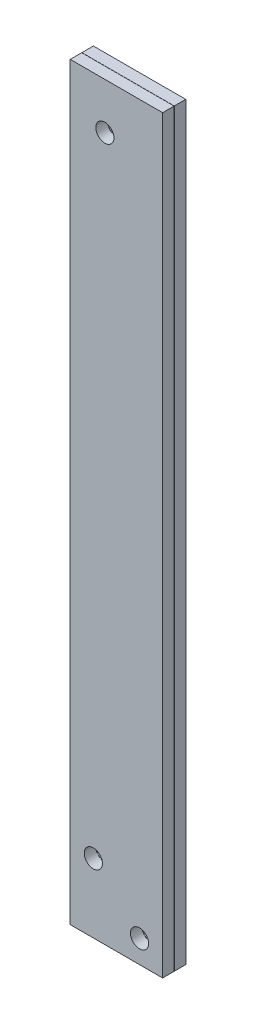
ISO-10303-21;
HEADER;
FILE_DESCRIPTION(('STEP AP214'),'2;1');
FILE_NAME('part.step','',(''),(''),'','','');
FILE_SCHEMA(('AUTOMOTIVE_DESIGN { 1 0 10303 214 1 1 1 1 }'));
ENDSEC;
DATA;
#1=APPLICATION_CONTEXT('core data for automotive mechanical design processes');
#2=APPLICATION_PROTOCOL_DEFINITION('international standard','automotive_design',2000,#1);
#3=PRODUCT_CONTEXT('',#1,'mechanical');
#4=PRODUCT('Part','Part','',(#3));
#5=PRODUCT_RELATED_PRODUCT_CATEGORY('part','',(#4));
#6=PRODUCT_DEFINITION_FORMATION('','',#4);
#7=PRODUCT_DEFINITION_CONTEXT('part definition',#1,'design');
#8=PRODUCT_DEFINITION('design','',#6,#7);
#9=PRODUCT_DEFINITION_SHAPE('','',#8);
#10=(LENGTH_UNIT() NAMED_UNIT(*) SI_UNIT(.MILLI.,.METRE.));
#11=(NAMED_UNIT(*) PLANE_ANGLE_UNIT() SI_UNIT($,.RADIAN.));
#12=(NAMED_UNIT(*) SI_UNIT($,.STERADIAN.) SOLID_ANGLE_UNIT());
#13=UNCERTAINTY_MEASURE_WITH_UNIT(LENGTH_MEASURE(1.E-05),#10,'distance_accuracy_value','');
#14=(GEOMETRIC_REPRESENTATION_CONTEXT(3) GLOBAL_UNCERTAINTY_ASSIGNED_CONTEXT((#13)) GLOBAL_UNIT_ASSIGNED_CONTEXT((#10,
#11,#12)) REPRESENTATION_CONTEXT('',''));
#15=CARTESIAN_POINT('',(0.,0.,0.));
#16=DIRECTION('',(0.,0.,1.));
#17=DIRECTION('',(1.,0.,0.));
#18=AXIS2_PLACEMENT_3D('',#15,#16,#17);
#19=CARTESIAN_POINT('',(0.,0.,6.41));
#20=DIRECTION('',(0.,0.,1.));
#21=DIRECTION('',(0.,-1.,0.));
#22=AXIS2_PLACEMENT_3D('',#19,#20,#21);
#23=PLANE('',#22);
#24=CARTESIAN_POINT('',(12.70000000003,-374.162201783294,6.40999999999995));
#25=DIRECTION('',(0.,0.,1.));
#26=DIRECTION('',(0.,-1.,0.));
#27=AXIS2_PLACEMENT_3D('',#24,#25,#26);
#28=CIRCLE('',#27,5.);
#29=CARTESIAN_POINT('',(12.70000000003,-379.162201783294,6.40999999999995));
#30=VERTEX_POINT('',#29);
#31=EDGE_CURVE('E158',#30,#30,#28,.T.);
#32=ORIENTED_EDGE('',*,*,#31,.T.);
#33=EDGE_LOOP('',(#32));
#34=FACE_BOUND('',#33,.T.);
#35=CARTESIAN_POINT('',(38.1000000000302,-399.562201783293,6.40999999999995));
#36=DIRECTION('',(0.,0.,1.));
#37=DIRECTION('',(0.,-1.,0.));
#38=AXIS2_PLACEMENT_3D('',#35,#36,#37);
#39=CIRCLE('',#38,5.);
#40=CARTESIAN_POINT('',(38.1000000000302,-404.562201783293,6.40999999999995));
#41=VERTEX_POINT('',#40);
#42=EDGE_CURVE('E160',#41,#41,#39,.T.);
#43=ORIENTED_EDGE('',*,*,#42,.T.);
#44=EDGE_LOOP('',(#43));
#45=FACE_BOUND('',#44,.T.);
#46=CARTESIAN_POINT('',(19.0400000000212,-25.3999999999761,6.41));
#47=DIRECTION('',(0.,0.,1.));
#48=DIRECTION('',(0.,-1.,0.));
#49=AXIS2_PLACEMENT_3D('',#46,#47,#48);
#50=CIRCLE('',#49,5.);
#51=CARTESIAN_POINT('',(19.0400000000212,-30.3999999999761,6.40999999999999));
#52=VERTEX_POINT('',#51);
#53=EDGE_CURVE('E111',#52,#52,#50,.T.);
#54=ORIENTED_EDGE('',*,*,#53,.T.);
#55=EDGE_LOOP('',(#54));
#56=FACE_BOUND('',#55,.T.);
#57=DIRECTION('',(0.,-1.,0.));
#58=VECTOR('',#57,1.);
#59=CARTESIAN_POINT('',(50.7999999999999,0.,6.41));
#60=LINE('',#59,#58);
#61=CARTESIAN_POINT('',(50.7999999999999,0.,6.41));
#62=VERTEX_POINT('',#61);
#63=CARTESIAN_POINT('',(50.8,-412.09566061,6.40999999999995));
#64=VERTEX_POINT('',#63);
#65=EDGE_CURVE('E108',#62,#64,#60,.T.);
#66=ORIENTED_EDGE('',*,*,#65,.T.);
#67=DIRECTION('',(1.,0.,0.));
#68=VECTOR('',#67,1.);
#69=CARTESIAN_POINT('',(0.,-412.09566061,6.40999999999995));
#70=LINE('',#69,#68);
#71=CARTESIAN_POINT('',(0.,-412.09566061,6.40999999999995));
#72=VERTEX_POINT('',#71);
#73=EDGE_CURVE('E12',#72,#64,#70,.T.);
#74=ORIENTED_EDGE('',*,*,#73,.F.);
#75=DIRECTION('',(0.,-1.,0.));
#76=VECTOR('',#75,1.);
#77=CARTESIAN_POINT('',(0.,0.,6.41));
#78=LINE('',#77,#76);
#79=CARTESIAN_POINT('',(0.,0.,6.41));
#80=VERTEX_POINT('',#79);
#81=EDGE_CURVE('E62',#80,#72,#78,.T.);
#82=ORIENTED_EDGE('',*,*,#81,.F.);
#83=DIRECTION('',(1.,0.,0.));
#84=VECTOR('',#83,1.);
#85=CARTESIAN_POINT('',(0.,0.,6.41));
#86=LINE('',#85,#84);
#87=EDGE_CURVE('E47',#80,#62,#86,.T.);
#88=ORIENTED_EDGE('',*,*,#87,.T.);
#89=EDGE_LOOP('',(#66,#74,#82,#88));
#90=FACE_BOUND('',#89,.T.);
#91=ADVANCED_FACE('F44',(#34,#45,#56,#90),#23,.F.);
#92=CARTESIAN_POINT('',(0.,-412.09566061,0.));
#93=DIRECTION('',(0.,-1.,0.));
#94=DIRECTION('',(1.,0.,0.));
#95=AXIS2_PLACEMENT_3D('',#92,#93,#94);
#96=PLANE('',#95);
#97=DIRECTION('',(0.,0.,-1.));
#98=VECTOR('',#97,1.);
#99=CARTESIAN_POINT('',(50.8,-412.09566061,0.));
#100=LINE('',#99,#98);
#101=CARTESIAN_POINT('',(50.8,-412.09566061,12.7199999999999));
#102=VERTEX_POINT('',#101);
#103=EDGE_CURVE('E103',#102,#64,#100,.T.);
#104=ORIENTED_EDGE('',*,*,#103,.F.);
#105=DIRECTION('',(1.,0.,0.));
#106=VECTOR('',#105,1.);
#107=CARTESIAN_POINT('',(0.,-412.09566061,12.7199999999999));
#108=LINE('',#107,#106);
#109=CARTESIAN_POINT('',(0.,-412.09566061,12.7199999999999));
#110=VERTEX_POINT('',#109);
#111=EDGE_CURVE('E53',#110,#102,#108,.T.);
#112=ORIENTED_EDGE('',*,*,#111,.F.);
#113=DIRECTION('',(0.,0.,-1.));
#114=VECTOR('',#113,1.);
#115=CARTESIAN_POINT('',(0.,-412.09566061,0.));
#116=LINE('',#115,#114);
#117=EDGE_CURVE('E99',#110,#72,#116,.T.);
#118=ORIENTED_EDGE('',*,*,#117,.T.);
#119=ORIENTED_EDGE('',*,*,#73,.T.);
#120=EDGE_LOOP('',(#104,#112,#118,#119));
#121=FACE_BOUND('',#120,.T.);
#122=ADVANCED_FACE('F119',(#121),#96,.T.);
#123=CARTESIAN_POINT('',(0.,0.,12.72));
#124=DIRECTION('',(0.,0.,1.));
#125=DIRECTION('',(0.,-1.,0.));
#126=AXIS2_PLACEMENT_3D('',#123,#124,#125);
#127=PLANE('',#126);
#128=CARTESIAN_POINT('',(12.70000000003,-374.162201783294,12.72));
#129=DIRECTION('',(0.,0.,1.));
#130=DIRECTION('',(1.,0.,0.));
#131=AXIS2_PLACEMENT_3D('',#128,#129,#130);
#132=CIRCLE('',#131,5.);
#133=CARTESIAN_POINT('',(17.70000000003,-374.162201783294,12.72));
#134=VERTEX_POINT('',#133);
#135=EDGE_CURVE('E155',#134,#134,#132,.T.);
#136=ORIENTED_EDGE('',*,*,#135,.F.);
#137=EDGE_LOOP('',(#136));
#138=FACE_BOUND('',#137,.T.);
#139=CARTESIAN_POINT('',(38.1000000000302,-399.562201783293,12.72));
#140=DIRECTION('',(0.,0.,1.));
#141=DIRECTION('',(1.,0.,0.));
#142=AXIS2_PLACEMENT_3D('',#139,#140,#141);
#143=CIRCLE('',#142,5.);
#144=CARTESIAN_POINT('',(43.1000000000302,-399.562201783293,12.72));
#145=VERTEX_POINT('',#144);
#146=EDGE_CURVE('E172',#145,#145,#143,.T.);
#147=ORIENTED_EDGE('',*,*,#146,.F.);
#148=EDGE_LOOP('',(#147));
#149=FACE_BOUND('',#148,.T.);
#150=CARTESIAN_POINT('',(19.0400000000212,-25.3999999999761,12.72));
#151=DIRECTION('',(0.,0.,1.));
#152=DIRECTION('',(1.,0.,0.));
#153=AXIS2_PLACEMENT_3D('',#150,#151,#152);
#154=CIRCLE('',#153,5.);
#155=CARTESIAN_POINT('',(24.0400000000212,-25.3999999999761,12.72));
#156=VERTEX_POINT('',#155);
#157=EDGE_CURVE('E159',#156,#156,#154,.T.);
#158=ORIENTED_EDGE('',*,*,#157,.F.);
#159=EDGE_LOOP('',(#158));
#160=FACE_BOUND('',#159,.T.);
#161=DIRECTION('',(0.,-1.,0.));
#162=VECTOR('',#161,1.);
#163=CARTESIAN_POINT('',(50.7999999999999,0.,12.72));
#164=LINE('',#163,#162);
#165=CARTESIAN_POINT('',(50.7999999999999,0.,12.72));
#166=VERTEX_POINT('',#165);
#167=EDGE_CURVE('E95',#166,#102,#164,.T.);
#168=ORIENTED_EDGE('',*,*,#167,.F.);
#169=DIRECTION('',(1.,0.,0.));
#170=VECTOR('',#169,1.);
#171=CARTESIAN_POINT('',(0.,0.,12.72));
#172=LINE('',#171,#170);
#173=CARTESIAN_POINT('',(0.,0.,12.72));
#174=VERTEX_POINT('',#173);
#175=EDGE_CURVE('E91',#174,#166,#172,.T.);
#176=ORIENTED_EDGE('',*,*,#175,.F.);
#177=DIRECTION('',(0.,-1.,0.));
#178=VECTOR('',#177,1.);
#179=CARTESIAN_POINT('',(0.,0.,12.72));
#180=LINE('',#179,#178);
#181=EDGE_CURVE('E94',#174,#110,#180,.T.);
#182=ORIENTED_EDGE('',*,*,#181,.T.);
#183=ORIENTED_EDGE('',*,*,#111,.T.);
#184=EDGE_LOOP('',(#168,#176,#182,#183));
#185=FACE_BOUND('',#184,.T.);
#186=ADVANCED_FACE('F93',(#138,#149,#160,#185),#127,.T.);
#187=CARTESIAN_POINT('',(0.,0.,0.));
#188=DIRECTION('',(0.,1.,0.));
#189=DIRECTION('',(-1.,0.,0.));
#190=AXIS2_PLACEMENT_3D('',#187,#188,#189);
#191=PLANE('',#190);
#192=DIRECTION('',(0.,0.,1.));
#193=VECTOR('',#192,1.);
#194=CARTESIAN_POINT('',(50.7999999999999,0.,0.));
#195=LINE('',#194,#193);
#196=EDGE_CURVE('E110',#62,#166,#195,.T.);
#197=ORIENTED_EDGE('',*,*,#196,.F.);
#198=ORIENTED_EDGE('',*,*,#87,.F.);
#199=DIRECTION('',(0.,0.,1.));
#200=VECTOR('',#199,1.);
#201=CARTESIAN_POINT('',(0.,0.,0.));
#202=LINE('',#201,#200);
#203=EDGE_CURVE('E98',#80,#174,#202,.T.);
#204=ORIENTED_EDGE('',*,*,#203,.T.);
#205=ORIENTED_EDGE('',*,*,#175,.T.);
#206=EDGE_LOOP('',(#197,#198,#204,#205));
#207=FACE_BOUND('',#206,.T.);
#208=ADVANCED_FACE('F101',(#207),#191,.T.);
#209=CARTESIAN_POINT('',(0.,0.,0.));
#210=DIRECTION('',(1.,0.,0.));
#211=DIRECTION('',(0.,1.,0.));
#212=AXIS2_PLACEMENT_3D('',#209,#210,#211);
#213=PLANE('',#212);
#214=ORIENTED_EDGE('',*,*,#81,.T.);
#215=ORIENTED_EDGE('',*,*,#117,.F.);
#216=ORIENTED_EDGE('',*,*,#181,.F.);
#217=ORIENTED_EDGE('',*,*,#203,.F.);
#218=EDGE_LOOP('',(#214,#215,#216,#217));
#219=FACE_BOUND('',#218,.T.);
#220=ADVANCED_FACE('F97',(#219),#213,.F.);
#221=CARTESIAN_POINT('',(50.7999999999999,0.,0.));
#222=DIRECTION('',(1.,0.,0.));
#223=DIRECTION('',(0.,1.,0.));
#224=AXIS2_PLACEMENT_3D('',#221,#222,#223);
#225=PLANE('',#224);
#226=ORIENTED_EDGE('',*,*,#65,.F.);
#227=ORIENTED_EDGE('',*,*,#196,.T.);
#228=ORIENTED_EDGE('',*,*,#167,.T.);
#229=ORIENTED_EDGE('',*,*,#103,.T.);
#230=EDGE_LOOP('',(#226,#227,#228,#229));
#231=FACE_BOUND('',#230,.T.);
#232=ADVANCED_FACE('F118',(#231),#225,.T.);
#233=CARTESIAN_POINT('',(19.0400000000212,-25.3999999999761,-18.28));
#234=DIRECTION('',(0.,0.,1.));
#235=DIRECTION('',(1.,0.,0.));
#236=AXIS2_PLACEMENT_3D('',#233,#234,#235);
#237=CYLINDRICAL_SURFACE('',#236,5.);
#238=ORIENTED_EDGE('',*,*,#157,.T.);
#239=EDGE_LOOP('',(#238));
#240=FACE_BOUND('',#239,.T.);
#241=ORIENTED_EDGE('',*,*,#53,.F.);
#242=EDGE_LOOP('',(#241));
#243=FACE_BOUND('',#242,.T.);
#244=ADVANCED_FACE('F138',(#240,#243),#237,.F.);
#245=CARTESIAN_POINT('',(38.1000000000302,-399.562201783293,-22.28));
#246=DIRECTION('',(0.,0.,1.));
#247=DIRECTION('',(1.,0.,0.));
#248=AXIS2_PLACEMENT_3D('',#245,#246,#247);
#249=CYLINDRICAL_SURFACE('',#248,5.);
#250=ORIENTED_EDGE('',*,*,#146,.T.);
#251=EDGE_LOOP('',(#250));
#252=FACE_BOUND('',#251,.T.);
#253=ORIENTED_EDGE('',*,*,#42,.F.);
#254=EDGE_LOOP('',(#253));
#255=FACE_BOUND('',#254,.T.);
#256=ADVANCED_FACE('F142',(#252,#255),#249,.F.);
#257=CARTESIAN_POINT('',(12.70000000003,-374.162201783294,-22.28));
#258=DIRECTION('',(0.,0.,1.));
#259=DIRECTION('',(1.,0.,0.));
#260=AXIS2_PLACEMENT_3D('',#257,#258,#259);
#261=CYLINDRICAL_SURFACE('',#260,5.);
#262=ORIENTED_EDGE('',*,*,#135,.T.);
#263=EDGE_LOOP('',(#262));
#264=FACE_BOUND('',#263,.T.);
#265=ORIENTED_EDGE('',*,*,#31,.F.);
#266=EDGE_LOOP('',(#265));
#267=FACE_BOUND('',#266,.T.);
#268=ADVANCED_FACE('F146',(#264,#267),#261,.F.);
#269=CLOSED_SHELL('',(#91,#122,#186,#208,#220,#232,#244,#256,#268));
#270=MANIFOLD_SOLID_BREP('B2',#269);
#271=CARTESIAN_POINT('',(0.,-412.09566061,6.31));
#272=DIRECTION('',(1.,0.,0.));
#273=DIRECTION('',(0.,0.,-1.));
#274=AXIS2_PLACEMENT_3D('',#271,#272,#273);
#275=PLANE('',#274);
#276=DIRECTION('',(0.,-1.,0.));
#277=VECTOR('',#276,1.);
#278=CARTESIAN_POINT('',(0.,-412.09566061,0.));
#279=LINE('',#278,#277);
#280=CARTESIAN_POINT('',(0.,0.,0.));
#281=VERTEX_POINT('',#280);
#282=CARTESIAN_POINT('',(0.,-412.09566061,0.));
#283=VERTEX_POINT('',#282);
#284=EDGE_CURVE('E296',#281,#283,#279,.T.);
#285=ORIENTED_EDGE('',*,*,#284,.T.);
#286=DIRECTION('',(0.,0.,-1.));
#287=VECTOR('',#286,1.);
#288=CARTESIAN_POINT('',(0.,-412.09566061,6.31));
#289=LINE('',#288,#287);
#290=CARTESIAN_POINT('',(0.,-412.09566061,6.31));
#291=VERTEX_POINT('',#290);
#292=EDGE_CURVE('E42',#291,#283,#289,.T.);
#293=ORIENTED_EDGE('',*,*,#292,.F.);
#294=DIRECTION('',(0.,-1.,0.));
#295=VECTOR('',#294,1.);
#296=CARTESIAN_POINT('',(0.,-412.09566061,6.31));
#297=LINE('',#296,#295);
#298=CARTESIAN_POINT('',(0.,0.,6.31));
#299=VERTEX_POINT('',#298);
#300=EDGE_CURVE('E282',#299,#291,#297,.T.);
#301=ORIENTED_EDGE('',*,*,#300,.F.);
#302=DIRECTION('',(0.,0.,-1.));
#303=VECTOR('',#302,1.);
#304=CARTESIAN_POINT('',(0.,0.,6.31));
#305=LINE('',#304,#303);
#306=EDGE_CURVE('E292',#299,#281,#305,.T.);
#307=ORIENTED_EDGE('',*,*,#306,.T.);
#308=EDGE_LOOP('',(#285,#293,#301,#307));
#309=FACE_BOUND('',#308,.T.);
#310=ADVANCED_FACE('F230',(#309),#275,.F.);
#311=CARTESIAN_POINT('',(50.8,-412.09566061,6.31));
#312=DIRECTION('',(0.,1.,0.));
#313=DIRECTION('',(0.,0.,1.));
#314=AXIS2_PLACEMENT_3D('',#311,#312,#313);
#315=PLANE('',#314);
#316=DIRECTION('',(1.,0.,0.));
#317=VECTOR('',#316,1.);
#318=CARTESIAN_POINT('',(50.8,-412.09566061,0.));
#319=LINE('',#318,#317);
#320=CARTESIAN_POINT('',(50.8,-412.09566061,0.));
#321=VERTEX_POINT('',#320);
#322=EDGE_CURVE('E287',#283,#321,#319,.T.);
#323=ORIENTED_EDGE('',*,*,#322,.T.);
#324=DIRECTION('',(0.,0.,-1.));
#325=VECTOR('',#324,1.);
#326=CARTESIAN_POINT('',(50.8,-412.09566061,6.31));
#327=LINE('',#326,#325);
#328=CARTESIAN_POINT('',(50.8,-412.09566061,6.31));
#329=VERTEX_POINT('',#328);
#330=EDGE_CURVE('E239',#329,#321,#327,.T.);
#331=ORIENTED_EDGE('',*,*,#330,.F.);
#332=DIRECTION('',(1.,0.,0.));
#333=VECTOR('',#332,1.);
#334=CARTESIAN_POINT('',(50.8,-412.09566061,6.31));
#335=LINE('',#334,#333);
#336=EDGE_CURVE('E277',#291,#329,#335,.T.);
#337=ORIENTED_EDGE('',*,*,#336,.F.);
#338=ORIENTED_EDGE('',*,*,#292,.T.);
#339=EDGE_LOOP('',(#323,#331,#337,#338));
#340=FACE_BOUND('',#339,.T.);
#341=ADVANCED_FACE('F286',(#340),#315,.F.);
#342=CARTESIAN_POINT('',(50.7999999999999,0.,6.31));
#343=DIRECTION('',(-1.,0.,0.));
#344=DIRECTION('',(0.,-1.,0.));
#345=AXIS2_PLACEMENT_3D('',#342,#343,#344);
#346=PLANE('',#345);
#347=DIRECTION('',(0.,1.,0.));
#348=VECTOR('',#347,1.);
#349=CARTESIAN_POINT('',(50.7999999999999,0.,0.));
#350=LINE('',#349,#348);
#351=CARTESIAN_POINT('',(50.7999999999999,0.,0.));
#352=VERTEX_POINT('',#351);
#353=EDGE_CURVE('E264',#321,#352,#350,.T.);
#354=ORIENTED_EDGE('',*,*,#353,.T.);
#355=DIRECTION('',(0.,0.,-1.));
#356=VECTOR('',#355,1.);
#357=CARTESIAN_POINT('',(50.7999999999999,0.,6.31));
#358=LINE('',#357,#356);
#359=CARTESIAN_POINT('',(50.7999999999999,0.,6.31));
#360=VERTEX_POINT('',#359);
#361=EDGE_CURVE('E288',#360,#352,#358,.T.);
#362=ORIENTED_EDGE('',*,*,#361,.F.);
#363=DIRECTION('',(0.,1.,0.));
#364=VECTOR('',#363,1.);
#365=CARTESIAN_POINT('',(50.8,-361.29566061,6.31));
#366=LINE('',#365,#364);
#367=EDGE_CURVE('E280',#329,#360,#366,.T.);
#368=ORIENTED_EDGE('',*,*,#367,.F.);
#369=ORIENTED_EDGE('',*,*,#330,.T.);
#370=EDGE_LOOP('',(#354,#362,#368,#369));
#371=FACE_BOUND('',#370,.T.);
#372=ADVANCED_FACE('F290',(#371),#346,.F.);
#373=CARTESIAN_POINT('',(0.,0.,6.31));
#374=DIRECTION('',(0.,-1.,0.));
#375=DIRECTION('',(0.,0.,-1.));
#376=AXIS2_PLACEMENT_3D('',#373,#374,#375);
#377=PLANE('',#376);
#378=DIRECTION('',(-1.,0.,0.));
#379=VECTOR('',#378,1.);
#380=CARTESIAN_POINT('',(0.,0.,0.));
#381=LINE('',#380,#379);
#382=EDGE_CURVE('E270',#352,#281,#381,.T.);
#383=ORIENTED_EDGE('',*,*,#382,.T.);
#384=ORIENTED_EDGE('',*,*,#306,.F.);
#385=DIRECTION('',(-1.,0.,0.));
#386=VECTOR('',#385,1.);
#387=CARTESIAN_POINT('',(0.,0.,6.31));
#388=LINE('',#387,#386);
#389=EDGE_CURVE('E248',#360,#299,#388,.T.);
#390=ORIENTED_EDGE('',*,*,#389,.F.);
#391=ORIENTED_EDGE('',*,*,#361,.T.);
#392=EDGE_LOOP('',(#383,#384,#390,#391));
#393=FACE_BOUND('',#392,.T.);
#394=ADVANCED_FACE('F347',(#393),#377,.F.);
#395=CARTESIAN_POINT('',(0.,0.,6.31));
#396=DIRECTION('',(0.,0.,-1.));
#397=DIRECTION('',(-1.,0.,0.));
#398=AXIS2_PLACEMENT_3D('',#395,#396,#397);
#399=PLANE('',#398);
#400=CARTESIAN_POINT('',(12.70000000003,-374.162201783294,6.31));
#401=DIRECTION('',(0.,0.,-1.));
#402=DIRECTION('',(-1.,0.,0.));
#403=AXIS2_PLACEMENT_3D('',#400,#401,#402);
#404=CIRCLE('',#403,5.);
#405=CARTESIAN_POINT('',(7.70000000002996,-374.162201783294,6.31));
#406=VERTEX_POINT('',#405);
#407=EDGE_CURVE('E307',#406,#406,#404,.T.);
#408=ORIENTED_EDGE('',*,*,#407,.T.);
#409=EDGE_LOOP('',(#408));
#410=FACE_BOUND('',#409,.T.);
#411=CARTESIAN_POINT('',(38.1000000000302,-399.562201783293,6.31));
#412=DIRECTION('',(0.,0.,-1.));
#413=DIRECTION('',(-1.,0.,0.));
#414=AXIS2_PLACEMENT_3D('',#411,#412,#413);
#415=CIRCLE('',#414,5.);
#416=CARTESIAN_POINT('',(33.1000000000302,-399.562201783293,6.31));
#417=VERTEX_POINT('',#416);
#418=EDGE_CURVE('E310',#417,#417,#415,.T.);
#419=ORIENTED_EDGE('',*,*,#418,.T.);
#420=EDGE_LOOP('',(#419));
#421=FACE_BOUND('',#420,.T.);
#422=CARTESIAN_POINT('',(19.0400000000212,-25.3999999999761,6.31));
#423=DIRECTION('',(0.,0.,-1.));
#424=DIRECTION('',(-1.,0.,0.));
#425=AXIS2_PLACEMENT_3D('',#422,#423,#424);
#426=CIRCLE('',#425,5.);
#427=CARTESIAN_POINT('',(14.0400000000212,-25.3999999999761,6.31));
#428=VERTEX_POINT('',#427);
#429=EDGE_CURVE('E299',#428,#428,#426,.T.);
#430=ORIENTED_EDGE('',*,*,#429,.T.);
#431=EDGE_LOOP('',(#430));
#432=FACE_BOUND('',#431,.T.);
#433=ORIENTED_EDGE('',*,*,#300,.T.);
#434=ORIENTED_EDGE('',*,*,#336,.T.);
#435=ORIENTED_EDGE('',*,*,#367,.T.);
#436=ORIENTED_EDGE('',*,*,#389,.T.);
#437=EDGE_LOOP('',(#433,#434,#435,#436));
#438=FACE_BOUND('',#437,.T.);
#439=ADVANCED_FACE('F278',(#410,#421,#432,#438),#399,.F.);
#440=CARTESIAN_POINT('',(0.,0.,0.));
#441=DIRECTION('',(0.,0.,-1.));
#442=DIRECTION('',(-1.,0.,0.));
#443=AXIS2_PLACEMENT_3D('',#440,#441,#442);
#444=PLANE('',#443);
#445=CARTESIAN_POINT('',(12.70000000003,-374.162201783294,0.));
#446=DIRECTION('',(0.,0.,-1.));
#447=DIRECTION('',(-1.,0.,0.));
#448=AXIS2_PLACEMENT_3D('',#445,#446,#447);
#449=CIRCLE('',#448,5.);
#450=CARTESIAN_POINT('',(7.70000000002996,-374.162201783294,0.));
#451=VERTEX_POINT('',#450);
#452=EDGE_CURVE('E233',#451,#451,#449,.T.);
#453=ORIENTED_EDGE('',*,*,#452,.F.);
#454=EDGE_LOOP('',(#453));
#455=FACE_BOUND('',#454,.T.);
#456=CARTESIAN_POINT('',(38.1000000000302,-399.562201783293,0.));
#457=DIRECTION('',(0.,0.,-1.));
#458=DIRECTION('',(-1.,0.,0.));
#459=AXIS2_PLACEMENT_3D('',#456,#457,#458);
#460=CIRCLE('',#459,5.);
#461=CARTESIAN_POINT('',(33.1000000000302,-399.562201783293,0.));
#462=VERTEX_POINT('',#461);
#463=EDGE_CURVE('E308',#462,#462,#460,.T.);
#464=ORIENTED_EDGE('',*,*,#463,.F.);
#465=EDGE_LOOP('',(#464));
#466=FACE_BOUND('',#465,.T.);
#467=CARTESIAN_POINT('',(19.0400000000212,-25.3999999999761,0.));
#468=DIRECTION('',(0.,0.,-1.));
#469=DIRECTION('',(-1.,0.,0.));
#470=AXIS2_PLACEMENT_3D('',#467,#468,#469);
#471=CIRCLE('',#470,5.);
#472=CARTESIAN_POINT('',(14.0400000000212,-25.3999999999761,0.));
#473=VERTEX_POINT('',#472);
#474=EDGE_CURVE('E305',#473,#473,#471,.T.);
#475=ORIENTED_EDGE('',*,*,#474,.F.);
#476=EDGE_LOOP('',(#475));
#477=FACE_BOUND('',#476,.T.);
#478=ORIENTED_EDGE('',*,*,#284,.F.);
#479=ORIENTED_EDGE('',*,*,#382,.F.);
#480=ORIENTED_EDGE('',*,*,#353,.F.);
#481=ORIENTED_EDGE('',*,*,#322,.F.);
#482=EDGE_LOOP('',(#478,#479,#480,#481));
#483=FACE_BOUND('',#482,.T.);
#484=ADVANCED_FACE('F328',(#455,#466,#477,#483),#444,.T.);
#485=CARTESIAN_POINT('',(19.0400000000212,-25.3999999999761,-18.28));
#486=DIRECTION('',(0.,0.,1.));
#487=DIRECTION('',(1.,0.,0.));
#488=AXIS2_PLACEMENT_3D('',#485,#486,#487);
#489=CYLINDRICAL_SURFACE('',#488,5.);
#490=ORIENTED_EDGE('',*,*,#474,.T.);
#491=EDGE_LOOP('',(#490));
#492=FACE_BOUND('',#491,.T.);
#493=ORIENTED_EDGE('',*,*,#429,.F.);
#494=EDGE_LOOP('',(#493));
#495=FACE_BOUND('',#494,.T.);
#496=ADVANCED_FACE('F325',(#492,#495),#489,.F.);
#497=CARTESIAN_POINT('',(38.1000000000302,-399.562201783293,-22.28));
#498=DIRECTION('',(0.,0.,1.));
#499=DIRECTION('',(1.,0.,0.));
#500=AXIS2_PLACEMENT_3D('',#497,#498,#499);
#501=CYLINDRICAL_SURFACE('',#500,5.);
#502=ORIENTED_EDGE('',*,*,#463,.T.);
#503=EDGE_LOOP('',(#502));
#504=FACE_BOUND('',#503,.T.);
#505=ORIENTED_EDGE('',*,*,#418,.F.);
#506=EDGE_LOOP('',(#505));
#507=FACE_BOUND('',#506,.T.);
#508=ADVANCED_FACE('F327',(#504,#507),#501,.F.);
#509=CARTESIAN_POINT('',(12.70000000003,-374.162201783294,-22.28));
#510=DIRECTION('',(0.,0.,1.));
#511=DIRECTION('',(1.,0.,0.));
#512=AXIS2_PLACEMENT_3D('',#509,#510,#511);
#513=CYLINDRICAL_SURFACE('',#512,5.);
#514=ORIENTED_EDGE('',*,*,#452,.T.);
#515=EDGE_LOOP('',(#514));
#516=FACE_BOUND('',#515,.T.);
#517=ORIENTED_EDGE('',*,*,#407,.F.);
#518=EDGE_LOOP('',(#517));
#519=FACE_BOUND('',#518,.T.);
#520=ADVANCED_FACE('F335',(#516,#519),#513,.F.);
#521=CLOSED_SHELL('',(#310,#341,#372,#394,#439,#484,#496,#508,#520));
#522=MANIFOLD_SOLID_BREP('B6',#521);
#523=ADVANCED_BREP_SHAPE_REPRESENTATION('',(#18,#270,#522),#14);
#524=SHAPE_DEFINITION_REPRESENTATION(#9,#523);
ENDSEC;
END-ISO-10303-21;
